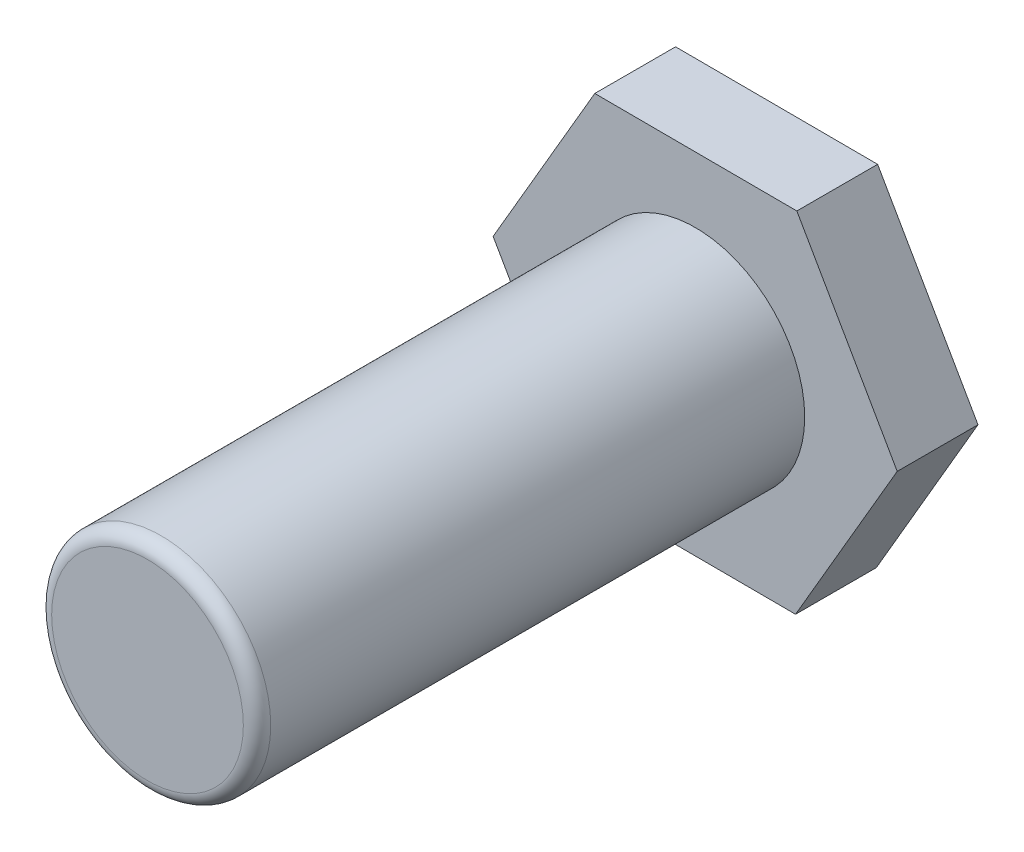
ISO-10303-21;
HEADER;
FILE_DESCRIPTION(('STEP AP214'),'2;1');
FILE_NAME('part.step','',(''),(''),'','','');
FILE_SCHEMA(('AUTOMOTIVE_DESIGN { 1 0 10303 214 1 1 1 1 }'));
ENDSEC;
DATA;
#1=APPLICATION_CONTEXT('core data for automotive mechanical design processes');
#2=APPLICATION_PROTOCOL_DEFINITION('international standard','automotive_design',2000,#1);
#3=PRODUCT_CONTEXT('',#1,'mechanical');
#4=PRODUCT('Part','Part','',(#3));
#5=PRODUCT_RELATED_PRODUCT_CATEGORY('part','',(#4));
#6=PRODUCT_DEFINITION_FORMATION('','',#4);
#7=PRODUCT_DEFINITION_CONTEXT('part definition',#1,'design');
#8=PRODUCT_DEFINITION('design','',#6,#7);
#9=PRODUCT_DEFINITION_SHAPE('','',#8);
#10=(LENGTH_UNIT() NAMED_UNIT(*) SI_UNIT(.MILLI.,.METRE.));
#11=(NAMED_UNIT(*) PLANE_ANGLE_UNIT() SI_UNIT($,.RADIAN.));
#12=(NAMED_UNIT(*) SI_UNIT($,.STERADIAN.) SOLID_ANGLE_UNIT());
#13=UNCERTAINTY_MEASURE_WITH_UNIT(LENGTH_MEASURE(1.E-05),#10,'distance_accuracy_value','');
#14=(GEOMETRIC_REPRESENTATION_CONTEXT(3) GLOBAL_UNCERTAINTY_ASSIGNED_CONTEXT((#13)) GLOBAL_UNIT_ASSIGNED_CONTEXT((#10,
#11,#12)) REPRESENTATION_CONTEXT('',''));
#15=CARTESIAN_POINT('',(0.,0.,0.));
#16=DIRECTION('',(0.,0.,1.));
#17=DIRECTION('',(1.,0.,0.));
#18=AXIS2_PLACEMENT_3D('',#15,#16,#17);
#19=CARTESIAN_POINT('',(7.37848609582735,-0.0272568098377245,2.95000000000001));
#20=DIRECTION('',(-0.867866528441834,-0.496797432370902,0.));
#21=DIRECTION('',(0.496797432370902,-0.867866528441834,0.));
#22=AXIS2_PLACEMENT_3D('',#19,#20,#21);
#23=PLANE('',#22);
#24=DIRECTION('',(-0.496797432370902,0.867866528441834,0.));
#25=VECTOR('',#24,1.);
#26=CARTESIAN_POINT('',(7.37848609582738,-0.0272568098377383,0.));
#27=LINE('',#26,#25);
#28=CARTESIAN_POINT('',(7.37848609582738,-0.0272568098377383,0.));
#29=VERTEX_POINT('',#28);
#30=CARTESIAN_POINT('',(3.71284813765931,6.37632799553788,0.));
#31=VERTEX_POINT('',#30);
#32=EDGE_CURVE('E148',#29,#31,#27,.T.);
#33=ORIENTED_EDGE('',*,*,#32,.T.);
#34=DIRECTION('',(0.,0.,-1.));
#35=VECTOR('',#34,1.);
#36=CARTESIAN_POINT('',(3.71284813765931,6.37632799553787,2.94999999999999));
#37=LINE('',#36,#35);
#38=CARTESIAN_POINT('',(3.71284813765931,6.37632799553787,2.94999999999999));
#39=VERTEX_POINT('',#38);
#40=EDGE_CURVE('E175',#39,#31,#37,.T.);
#41=ORIENTED_EDGE('',*,*,#40,.F.);
#42=DIRECTION('',(-0.496797432370902,0.867866528441834,0.));
#43=VECTOR('',#42,1.);
#44=CARTESIAN_POINT('',(7.37848609582735,-0.0272568098377245,2.95000000000001));
#45=LINE('',#44,#43);
#46=CARTESIAN_POINT('',(7.37848609582735,-0.0272568098377245,2.95000000000001));
#47=VERTEX_POINT('',#46);
#48=EDGE_CURVE('E164',#47,#39,#45,.T.);
#49=ORIENTED_EDGE('',*,*,#48,.F.);
#50=DIRECTION('',(0.,0.,-1.));
#51=VECTOR('',#50,1.);
#52=CARTESIAN_POINT('',(7.37848609582735,-0.0272568098377245,2.95000000000001));
#53=LINE('',#52,#51);
#54=EDGE_CURVE('E144',#47,#29,#53,.T.);
#55=ORIENTED_EDGE('',*,*,#54,.T.);
#56=EDGE_LOOP('',(#33,#41,#49,#55));
#57=FACE_BOUND('',#56,.T.);
#58=ADVANCED_FACE('F56',(#57),#23,.F.);
#59=CARTESIAN_POINT('',(3.71284813765931,6.37632799553787,2.94999999999999));
#60=DIRECTION('',(-0.00369406725283467,-0.999993176910289,0.));
#61=DIRECTION('',(0.999993176910289,-0.00369406725283417,0.));
#62=AXIS2_PLACEMENT_3D('',#59,#60,#61);
#63=PLANE('',#62);
#64=DIRECTION('',(-0.999993176910289,0.00369406725283417,0.));
#65=VECTOR('',#64,1.);
#66=CARTESIAN_POINT('',(3.71284813765931,6.37632799553788,0.));
#67=LINE('',#66,#65);
#68=CARTESIAN_POINT('',(-3.66563795816804,6.40358480537562,0.));
#69=VERTEX_POINT('',#68);
#70=EDGE_CURVE('E152',#31,#69,#67,.T.);
#71=ORIENTED_EDGE('',*,*,#70,.T.);
#72=DIRECTION('',(0.,0.,-1.));
#73=VECTOR('',#72,1.);
#74=CARTESIAN_POINT('',(-3.66563795816806,6.40358480537562,2.95000000000001));
#75=LINE('',#74,#73);
#76=CARTESIAN_POINT('',(-3.66563795816806,6.40358480537562,2.95000000000001));
#77=VERTEX_POINT('',#76);
#78=EDGE_CURVE('E171',#77,#69,#75,.T.);
#79=ORIENTED_EDGE('',*,*,#78,.F.);
#80=DIRECTION('',(-0.999993176910289,0.00369406725283417,0.));
#81=VECTOR('',#80,1.);
#82=CARTESIAN_POINT('',(3.71284813765931,6.37632799553787,2.94999999999999));
#83=LINE('',#82,#81);
#84=EDGE_CURVE('E112',#39,#77,#83,.T.);
#85=ORIENTED_EDGE('',*,*,#84,.F.);
#86=ORIENTED_EDGE('',*,*,#40,.T.);
#87=EDGE_LOOP('',(#71,#79,#85,#86));
#88=FACE_BOUND('',#87,.T.);
#89=ADVANCED_FACE('F206',(#88),#63,.F.);
#90=CARTESIAN_POINT('',(-3.66563795816806,6.40358480537562,2.95000000000001));
#91=DIRECTION('',(0.864172461188999,-0.503195744539387,0.));
#92=DIRECTION('',(0.503195744539387,0.864172461189,0.));
#93=AXIS2_PLACEMENT_3D('',#90,#91,#92);
#94=PLANE('',#93);
#95=DIRECTION('',(-0.503195744539387,-0.864172461189,0.));
#96=VECTOR('',#95,1.);
#97=CARTESIAN_POINT('',(-3.66563795816804,6.40358480537562,0.));
#98=LINE('',#97,#96);
#99=CARTESIAN_POINT('',(-7.37848609582734,0.0272568098377349,0.));
#100=VERTEX_POINT('',#99);
#101=EDGE_CURVE('E155',#69,#100,#98,.T.);
#102=ORIENTED_EDGE('',*,*,#101,.T.);
#103=DIRECTION('',(0.,0.,-1.));
#104=VECTOR('',#103,1.);
#105=CARTESIAN_POINT('',(-7.37848609582733,0.0272568098377418,2.94999999999999));
#106=LINE('',#105,#104);
#107=CARTESIAN_POINT('',(-7.37848609582733,0.0272568098377418,2.94999999999999));
#108=VERTEX_POINT('',#107);
#109=EDGE_CURVE('E136',#108,#100,#106,.T.);
#110=ORIENTED_EDGE('',*,*,#109,.F.);
#111=DIRECTION('',(-0.503195744539387,-0.864172461189,0.));
#112=VECTOR('',#111,1.);
#113=CARTESIAN_POINT('',(-3.66563795816806,6.40358480537562,2.95000000000001));
#114=LINE('',#113,#112);
#115=EDGE_CURVE('E125',#77,#108,#114,.T.);
#116=ORIENTED_EDGE('',*,*,#115,.F.);
#117=ORIENTED_EDGE('',*,*,#78,.T.);
#118=EDGE_LOOP('',(#102,#110,#116,#117));
#119=FACE_BOUND('',#118,.T.);
#120=ADVANCED_FACE('F209',(#119),#94,.F.);
#121=CARTESIAN_POINT('',(-7.37848609582733,0.0272568098377418,2.94999999999999));
#122=DIRECTION('',(0.867866528441834,0.496797432370902,0.));
#123=DIRECTION('',(-0.496797432370902,0.867866528441834,0.));
#124=AXIS2_PLACEMENT_3D('',#121,#122,#123);
#125=PLANE('',#124);
#126=DIRECTION('',(0.496797432370902,-0.867866528441834,0.));
#127=VECTOR('',#126,1.);
#128=CARTESIAN_POINT('',(-7.37848609582734,0.0272568098377349,0.));
#129=LINE('',#128,#127);
#130=CARTESIAN_POINT('',(-3.71284813765928,-6.37632799553787,0.));
#131=VERTEX_POINT('',#130);
#132=EDGE_CURVE('E134',#100,#131,#129,.T.);
#133=ORIENTED_EDGE('',*,*,#132,.T.);
#134=DIRECTION('',(0.,0.,-1.));
#135=VECTOR('',#134,1.);
#136=CARTESIAN_POINT('',(-3.71284813765928,-6.37632799553787,2.95000000000001));
#137=LINE('',#136,#135);
#138=CARTESIAN_POINT('',(-3.71284813765928,-6.37632799553787,2.95000000000001));
#139=VERTEX_POINT('',#138);
#140=EDGE_CURVE('E131',#139,#131,#137,.T.);
#141=ORIENTED_EDGE('',*,*,#140,.F.);
#142=DIRECTION('',(0.496797432370902,-0.867866528441834,0.));
#143=VECTOR('',#142,1.);
#144=CARTESIAN_POINT('',(-7.37848609582733,0.0272568098377418,2.94999999999999));
#145=LINE('',#144,#143);
#146=EDGE_CURVE('E119',#108,#139,#145,.T.);
#147=ORIENTED_EDGE('',*,*,#146,.F.);
#148=ORIENTED_EDGE('',*,*,#109,.T.);
#149=EDGE_LOOP('',(#133,#141,#147,#148));
#150=FACE_BOUND('',#149,.T.);
#151=ADVANCED_FACE('F132',(#150),#125,.F.);
#152=CARTESIAN_POINT('',(-3.71284813765928,-6.37632799553787,2.95000000000001));
#153=DIRECTION('',(0.00369406725283394,0.999993176910289,0.));
#154=DIRECTION('',(-0.999993176910289,0.00369406725283328,0.));
#155=AXIS2_PLACEMENT_3D('',#152,#153,#154);
#156=PLANE('',#155);
#157=DIRECTION('',(0.999993176910289,-0.00369406725283328,0.));
#158=VECTOR('',#157,1.);
#159=CARTESIAN_POINT('',(-3.71284813765928,-6.37632799553787,0.));
#160=LINE('',#159,#158);
#161=CARTESIAN_POINT('',(3.66563795816809,-6.40358480537562,0.));
#162=VERTEX_POINT('',#161);
#163=EDGE_CURVE('E97',#131,#162,#160,.T.);
#164=ORIENTED_EDGE('',*,*,#163,.T.);
#165=DIRECTION('',(0.,0.,-1.));
#166=VECTOR('',#165,1.);
#167=CARTESIAN_POINT('',(3.66563795816807,-6.40358480537562,2.94999999999998));
#168=LINE('',#167,#166);
#169=CARTESIAN_POINT('',(3.66563795816807,-6.40358480537562,2.94999999999998));
#170=VERTEX_POINT('',#169);
#171=EDGE_CURVE('E137',#170,#162,#168,.T.);
#172=ORIENTED_EDGE('',*,*,#171,.F.);
#173=DIRECTION('',(0.999993176910289,-0.00369406725283328,0.));
#174=VECTOR('',#173,1.);
#175=CARTESIAN_POINT('',(-3.71284813765928,-6.37632799553787,2.95000000000001));
#176=LINE('',#175,#174);
#177=EDGE_CURVE('E123',#139,#170,#176,.T.);
#178=ORIENTED_EDGE('',*,*,#177,.F.);
#179=ORIENTED_EDGE('',*,*,#140,.T.);
#180=EDGE_LOOP('',(#164,#172,#178,#179));
#181=FACE_BOUND('',#180,.T.);
#182=ADVANCED_FACE('F139',(#181),#156,.F.);
#183=CARTESIAN_POINT('',(3.66563795816807,-6.40358480537562,2.94999999999998));
#184=DIRECTION('',(-0.864172461188999,0.503195744539387,0.));
#185=DIRECTION('',(-0.503195744539387,-0.864172461189,0.));
#186=AXIS2_PLACEMENT_3D('',#183,#184,#185);
#187=PLANE('',#186);
#188=DIRECTION('',(0.503195744539387,0.864172461189,0.));
#189=VECTOR('',#188,1.);
#190=CARTESIAN_POINT('',(3.66563795816809,-6.40358480537562,0.));
#191=LINE('',#190,#189);
#192=EDGE_CURVE('E103',#162,#29,#191,.T.);
#193=ORIENTED_EDGE('',*,*,#192,.T.);
#194=ORIENTED_EDGE('',*,*,#54,.F.);
#195=DIRECTION('',(0.503195744539387,0.864172461189,0.));
#196=VECTOR('',#195,1.);
#197=CARTESIAN_POINT('',(3.66563795816807,-6.40358480537562,2.94999999999998));
#198=LINE('',#197,#196);
#199=EDGE_CURVE('E74',#170,#47,#198,.T.);
#200=ORIENTED_EDGE('',*,*,#199,.F.);
#201=ORIENTED_EDGE('',*,*,#171,.T.);
#202=EDGE_LOOP('',(#193,#194,#200,#201));
#203=FACE_BOUND('',#202,.T.);
#204=ADVANCED_FACE('F214',(#203),#187,.F.);
#205=CARTESIAN_POINT('',(0.,0.,2.95000000000001));
#206=DIRECTION('',(0.,0.,1.));
#207=DIRECTION('',(1.,0.,0.));
#208=AXIS2_PLACEMENT_3D('',#205,#206,#207);
#209=PLANE('',#208);
#210=CARTESIAN_POINT('',(0.,0.,2.95000000000001));
#211=DIRECTION('',(0.,0.,1.));
#212=DIRECTION('',(1.,0.,0.));
#213=AXIS2_PLACEMENT_3D('',#210,#211,#212);
#214=CIRCLE('',#213,4.);
#215=CARTESIAN_POINT('',(-4.,0.,2.95000000000001));
#216=VERTEX_POINT('',#215);
#217=EDGE_CURVE('E177',#216,#216,#214,.T.);
#218=ORIENTED_EDGE('',*,*,#217,.F.);
#219=EDGE_LOOP('',(#218));
#220=FACE_BOUND('',#219,.T.);
#221=ORIENTED_EDGE('',*,*,#48,.T.);
#222=ORIENTED_EDGE('',*,*,#84,.T.);
#223=ORIENTED_EDGE('',*,*,#115,.T.);
#224=ORIENTED_EDGE('',*,*,#146,.T.);
#225=ORIENTED_EDGE('',*,*,#177,.T.);
#226=ORIENTED_EDGE('',*,*,#199,.T.);
#227=EDGE_LOOP('',(#221,#222,#223,#224,#225,#226));
#228=FACE_BOUND('',#227,.T.);
#229=ADVANCED_FACE('F121',(#220,#228),#209,.T.);
#230=CARTESIAN_POINT('',(0.,0.,0.));
#231=DIRECTION('',(0.,0.,1.));
#232=DIRECTION('',(1.,0.,0.));
#233=AXIS2_PLACEMENT_3D('',#230,#231,#232);
#234=PLANE('',#233);
#235=ORIENTED_EDGE('',*,*,#32,.F.);
#236=ORIENTED_EDGE('',*,*,#192,.F.);
#237=ORIENTED_EDGE('',*,*,#163,.F.);
#238=ORIENTED_EDGE('',*,*,#132,.F.);
#239=ORIENTED_EDGE('',*,*,#101,.F.);
#240=ORIENTED_EDGE('',*,*,#70,.F.);
#241=EDGE_LOOP('',(#235,#236,#237,#238,#239,#240));
#242=FACE_BOUND('',#241,.T.);
#243=ADVANCED_FACE('F212',(#242),#234,.F.);
#244=CARTESIAN_POINT('',(0.,0.,22.95));
#245=DIRECTION('',(0.,0.,-1.));
#246=DIRECTION('',(-1.,0.,0.));
#247=AXIS2_PLACEMENT_3D('',#244,#245,#246);
#248=CYLINDRICAL_SURFACE('',#247,4.);
#249=CARTESIAN_POINT('',(0.,0.,22.45));
#250=DIRECTION('',(0.,0.,1.));
#251=DIRECTION('',(1.,0.,0.));
#252=AXIS2_PLACEMENT_3D('',#249,#250,#251);
#253=CIRCLE('',#252,4.);
#254=CARTESIAN_POINT('',(-4.,0.,22.45));
#255=VERTEX_POINT('',#254);
#256=EDGE_CURVE('E13',#255,#255,#253,.F.);
#257=CARTESIAN_POINT('',(-4.,0.,22.45));
#258=CARTESIAN_POINT('',(-4.,0.,22.246875));
#259=CARTESIAN_POINT('',(-4.,0.,22.04375));
#260=CARTESIAN_POINT('',(-4.,0.,21.6375));
#261=CARTESIAN_POINT('',(-4.,0.,21.434375));
#262=CARTESIAN_POINT('',(-4.,0.,21.028125));
#263=CARTESIAN_POINT('',(-4.,0.,20.825));
#264=CARTESIAN_POINT('',(-4.,0.,20.41875));
#265=CARTESIAN_POINT('',(-4.,0.,20.215625));
#266=CARTESIAN_POINT('',(-4.,0.,19.809375));
#267=CARTESIAN_POINT('',(-4.,0.,19.60625));
#268=CARTESIAN_POINT('',(-4.,0.,19.2));
#269=CARTESIAN_POINT('',(-4.,0.,18.996875));
#270=CARTESIAN_POINT('',(-4.,0.,18.590625));
#271=CARTESIAN_POINT('',(-4.,0.,18.3875));
#272=CARTESIAN_POINT('',(-4.,0.,17.98125));
#273=CARTESIAN_POINT('',(-4.,0.,17.778125));
#274=CARTESIAN_POINT('',(-4.,0.,17.371875));
#275=CARTESIAN_POINT('',(-4.,0.,17.16875));
#276=CARTESIAN_POINT('',(-4.,0.,16.7625));
#277=CARTESIAN_POINT('',(-4.,0.,16.559375));
#278=CARTESIAN_POINT('',(-4.,0.,16.153125));
#279=CARTESIAN_POINT('',(-4.,0.,15.95));
#280=CARTESIAN_POINT('',(-4.,0.,15.54375));
#281=CARTESIAN_POINT('',(-4.,0.,15.340625));
#282=CARTESIAN_POINT('',(-4.,0.,14.934375));
#283=CARTESIAN_POINT('',(-4.,0.,14.73125));
#284=CARTESIAN_POINT('',(-4.,0.,14.325));
#285=CARTESIAN_POINT('',(-4.,0.,14.121875));
#286=CARTESIAN_POINT('',(-4.,0.,13.715625));
#287=CARTESIAN_POINT('',(-4.,0.,13.5125));
#288=CARTESIAN_POINT('',(-4.,0.,13.10625));
#289=CARTESIAN_POINT('',(-4.,0.,12.903125));
#290=CARTESIAN_POINT('',(-4.,0.,12.496875));
#291=CARTESIAN_POINT('',(-4.,0.,12.29375));
#292=CARTESIAN_POINT('',(-4.,0.,11.8875));
#293=CARTESIAN_POINT('',(-4.,0.,11.684375));
#294=CARTESIAN_POINT('',(-4.,0.,11.278125));
#295=CARTESIAN_POINT('',(-4.,0.,11.075));
#296=CARTESIAN_POINT('',(-4.,0.,10.66875));
#297=CARTESIAN_POINT('',(-4.,0.,10.465625));
#298=CARTESIAN_POINT('',(-4.,0.,10.059375));
#299=CARTESIAN_POINT('',(-4.,0.,9.85625000000001));
#300=CARTESIAN_POINT('',(-4.,0.,9.45000000000001));
#301=CARTESIAN_POINT('',(-4.,0.,9.24687500000001));
#302=CARTESIAN_POINT('',(-4.,0.,8.84062500000001));
#303=CARTESIAN_POINT('',(-4.,0.,8.63750000000001));
#304=CARTESIAN_POINT('',(-4.,0.,8.23125000000001));
#305=CARTESIAN_POINT('',(-4.,0.,8.02812500000001));
#306=CARTESIAN_POINT('',(-4.,0.,7.62187500000001));
#307=CARTESIAN_POINT('',(-4.,0.,7.41875000000001));
#308=CARTESIAN_POINT('',(-4.,0.,7.01250000000001));
#309=CARTESIAN_POINT('',(-4.,0.,6.80937500000001));
#310=CARTESIAN_POINT('',(-4.,0.,6.40312500000001));
#311=CARTESIAN_POINT('',(-4.,0.,6.20000000000001));
#312=CARTESIAN_POINT('',(-4.,0.,5.79375000000001));
#313=CARTESIAN_POINT('',(-4.,0.,5.59062500000001));
#314=CARTESIAN_POINT('',(-4.,0.,5.18437500000001));
#315=CARTESIAN_POINT('',(-4.,0.,4.98125000000001));
#316=CARTESIAN_POINT('',(-4.,0.,4.57500000000001));
#317=CARTESIAN_POINT('',(-4.,0.,4.37187500000001));
#318=CARTESIAN_POINT('',(-4.,0.,3.96562500000001));
#319=CARTESIAN_POINT('',(-4.,0.,3.76250000000001));
#320=CARTESIAN_POINT('',(-4.,0.,3.35625000000001));
#321=CARTESIAN_POINT('',(-4.,0.,3.15312500000001));
#322=CARTESIAN_POINT('',(-4.,0.,2.95000000000001));
#323=B_SPLINE_CURVE_WITH_KNOTS('',3,(#257,#258,#259,#260,#261,#262,#263,#264,#265,#266,#267,
#268,#269,#270,#271,#272,#273,#274,#275,#276,#277,#278,#279,#280,#281,#282,#283,#284,#285,#286,
#287,#288,#289,#290,#291,#292,#293,#294,#295,#296,#297,#298,#299,#300,#301,#302,#303,#304,#305,
#306,#307,#308,#309,#310,#311,#312,#313,#314,#315,#316,#317,#318,#319,#320,#321,#322),
.UNSPECIFIED.,.F.,.F.,(4,2,2,2,2,2,2,2,2,2,2,2,2,2,2,2,2,2,2,2,2,2,2,2,2,2,2,2,2,2,2,2,4),(0.,
0.609374999999999,1.21875,1.828125,2.4375,3.046875,3.65625,4.26562499999999,4.875,5.484375,
6.09374999999999,6.703125,7.3125,7.921875,8.53124999999999,9.140625,9.74999999999999,10.359375,
10.96875,11.578125,12.1875,12.796875,13.40625,14.015625,14.625,15.234375,15.84375,16.453125,
17.0625,17.671875,18.28125,18.890625,19.5),.UNSPECIFIED.);
#324=EDGE_CURVE('BSEAM261',#255,#216,#323,.T.);
#325=ORIENTED_EDGE('',*,*,#256,.T.);
#326=ORIENTED_EDGE('',*,*,#217,.T.);
#327=ORIENTED_EDGE('',*,*,#324,.T.);
#328=ORIENTED_EDGE('',*,*,#324,.F.);
#329=EDGE_LOOP('',(#325,#327,#326,#328));
#330=FACE_BOUND('',#329,.T.);
#331=ADVANCED_FACE('F261',(#330),#248,.T.);
#332=CARTESIAN_POINT('',(0.,0.,22.95));
#333=DIRECTION('',(0.,0.,1.));
#334=DIRECTION('',(1.,0.,0.));
#335=AXIS2_PLACEMENT_3D('',#332,#333,#334);
#336=PLANE('',#335);
#337=CARTESIAN_POINT('',(0.,0.,22.95));
#338=DIRECTION('',(0.,0.,1.));
#339=DIRECTION('',(1.,0.,0.));
#340=AXIS2_PLACEMENT_3D('',#337,#338,#339);
#341=CIRCLE('',#340,3.5);
#342=CARTESIAN_POINT('',(3.5,0.,22.95));
#343=VERTEX_POINT('',#342);
#344=EDGE_CURVE('E66',#343,#343,#341,.T.);
#345=ORIENTED_EDGE('',*,*,#344,.T.);
#346=EDGE_LOOP('',(#345));
#347=FACE_BOUND('',#346,.T.);
#348=ADVANCED_FACE('F269',(#347),#336,.T.);
#349=CARTESIAN_POINT('',(0.,0.,22.45));
#350=DIRECTION('',(0.,0.,1.));
#351=DIRECTION('',(1.,0.,0.));
#352=AXIS2_PLACEMENT_3D('',#349,#350,#351);
#353=TOROIDAL_SURFACE('',#352,3.5,0.5);
#354=ORIENTED_EDGE('',*,*,#256,.F.);
#355=EDGE_LOOP('',(#354));
#356=FACE_BOUND('',#355,.T.);
#357=ORIENTED_EDGE('',*,*,#344,.F.);
#358=EDGE_LOOP('',(#357));
#359=FACE_BOUND('',#358,.T.);
#360=ADVANCED_FACE('F58',(#356,#359),#353,.T.);
#361=CLOSED_SHELL('',(#58,#89,#120,#151,#182,#204,#229,#243,#331,#348,#360));
#362=MANIFOLD_SOLID_BREP('B2',#361);
#363=ADVANCED_BREP_SHAPE_REPRESENTATION('',(#18,#362),#14);
#364=SHAPE_DEFINITION_REPRESENTATION(#9,#363);
ENDSEC;
END-ISO-10303-21;
